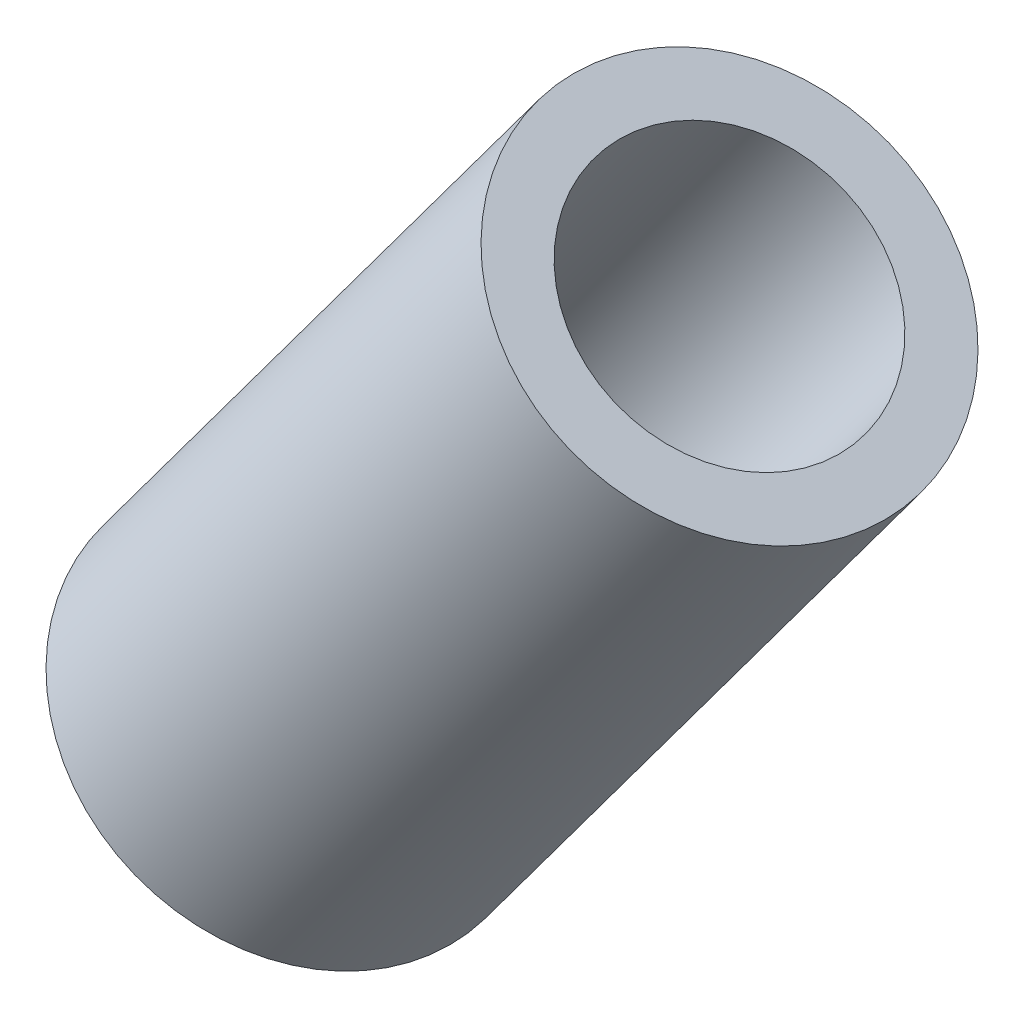
ISO-10303-21;
HEADER;
FILE_DESCRIPTION(('STEP AP214'),'2;1');
FILE_NAME('part.step','',(''),(''),'','','');
FILE_SCHEMA(('AUTOMOTIVE_DESIGN { 1 0 10303 214 1 1 1 1 }'));
ENDSEC;
DATA;
#1=APPLICATION_CONTEXT('core data for automotive mechanical design processes');
#2=APPLICATION_PROTOCOL_DEFINITION('international standard','automotive_design',2000,#1);
#3=PRODUCT_CONTEXT('',#1,'mechanical');
#4=PRODUCT('Part','Part','',(#3));
#5=PRODUCT_RELATED_PRODUCT_CATEGORY('part','',(#4));
#6=PRODUCT_DEFINITION_FORMATION('','',#4);
#7=PRODUCT_DEFINITION_CONTEXT('part definition',#1,'design');
#8=PRODUCT_DEFINITION('design','',#6,#7);
#9=PRODUCT_DEFINITION_SHAPE('','',#8);
#10=(LENGTH_UNIT() NAMED_UNIT(*) SI_UNIT(.MILLI.,.METRE.));
#11=(NAMED_UNIT(*) PLANE_ANGLE_UNIT() SI_UNIT($,.RADIAN.));
#12=(NAMED_UNIT(*) SI_UNIT($,.STERADIAN.) SOLID_ANGLE_UNIT());
#13=UNCERTAINTY_MEASURE_WITH_UNIT(LENGTH_MEASURE(1.E-05),#10,'distance_accuracy_value','');
#14=(GEOMETRIC_REPRESENTATION_CONTEXT(3) GLOBAL_UNCERTAINTY_ASSIGNED_CONTEXT((#13)) GLOBAL_UNIT_ASSIGNED_CONTEXT((#10,
#11,#12)) REPRESENTATION_CONTEXT('',''));
#15=CARTESIAN_POINT('',(0.,0.,0.));
#16=DIRECTION('',(0.,0.,1.));
#17=DIRECTION('',(1.,0.,0.));
#18=AXIS2_PLACEMENT_3D('',#15,#16,#17);
#19=CARTESIAN_POINT('',(0.,0.,0.));
#20=DIRECTION('',(0.596262476018023,0.802789548818902,0.));
#21=DIRECTION('',(-0.802789548818902,0.596262476018023,0.));
#22=AXIS2_PLACEMENT_3D('',#19,#20,#21);
#23=PLANE('',#22);
#24=CARTESIAN_POINT('',(0.,0.,0.));
#25=DIRECTION('',(0.596262476018023,0.802789548818902,0.));
#26=DIRECTION('',(-0.802789548818902,0.596262476018023,0.));
#27=AXIS2_PLACEMENT_3D('',#24,#25,#26);
#28=CIRCLE('',#27,9.525);
#29=CARTESIAN_POINT('',(-7.64657045250004,5.67940008407167,0.));
#30=VERTEX_POINT('',#29);
#31=EDGE_CURVE('E65',#30,#30,#28,.F.);
#32=ORIENTED_EDGE('',*,*,#31,.F.);
#33=EDGE_LOOP('',(#32));
#34=FACE_BOUND('',#33,.T.);
#35=CARTESIAN_POINT('',(0.,0.,0.));
#36=DIRECTION('',(0.596262476018023,0.802789548818902,0.));
#37=DIRECTION('',(-0.802789548818902,0.596262476018023,0.));
#38=AXIS2_PLACEMENT_3D('',#35,#36,#37);
#39=CIRCLE('',#38,13.49375);
#40=CARTESIAN_POINT('',(-10.8326414743751,8.0458167857682,0.));
#41=VERTEX_POINT('',#40);
#42=EDGE_CURVE('E57',#41,#41,#39,.T.);
#43=ORIENTED_EDGE('',*,*,#42,.F.);
#44=EDGE_LOOP('',(#43));
#45=FACE_BOUND('',#44,.T.);
#46=ADVANCED_FACE('F51',(#34,#45),#23,.F.);
#47=CARTESIAN_POINT('',(30.2901337817156,40.7817090800002,0.));
#48=DIRECTION('',(0.596262476018023,0.802789548818902,0.));
#49=DIRECTION('',(-0.802789548818902,0.596262476018023,0.));
#50=AXIS2_PLACEMENT_3D('',#47,#48,#49);
#51=PLANE('',#50);
#52=CARTESIAN_POINT('',(30.2901337817156,40.7817090800002,0.));
#53=DIRECTION('',(0.596262476018023,0.802789548818902,0.));
#54=DIRECTION('',(-0.802789548818902,0.596262476018023,0.));
#55=AXIS2_PLACEMENT_3D('',#52,#53,#54);
#56=CIRCLE('',#55,9.525);
#57=CARTESIAN_POINT('',(22.6435633292155,46.4611091640719,0.));
#58=VERTEX_POINT('',#57);
#59=EDGE_CURVE('E61',#58,#58,#56,.F.);
#60=ORIENTED_EDGE('',*,*,#59,.T.);
#61=EDGE_LOOP('',(#60));
#62=FACE_BOUND('',#61,.T.);
#63=CARTESIAN_POINT('',(30.2901337817156,40.7817090800002,0.));
#64=DIRECTION('',(0.596262476018023,0.802789548818902,0.));
#65=DIRECTION('',(-0.802789548818902,0.596262476018023,0.));
#66=AXIS2_PLACEMENT_3D('',#63,#64,#65);
#67=CIRCLE('',#66,13.49375);
#68=CARTESIAN_POINT('',(19.4574923073405,48.8275258657684,0.));
#69=VERTEX_POINT('',#68);
#70=EDGE_CURVE('E11',#69,#69,#67,.T.);
#71=ORIENTED_EDGE('',*,*,#70,.T.);
#72=EDGE_LOOP('',(#71));
#73=FACE_BOUND('',#72,.T.);
#74=ADVANCED_FACE('F76',(#62,#73),#51,.T.);
#75=CARTESIAN_POINT('',(0.,0.,0.));
#76=DIRECTION('',(0.596262476018023,0.802789548818902,0.));
#77=DIRECTION('',(-0.802789548818902,0.596262476018023,0.));
#78=AXIS2_PLACEMENT_3D('',#75,#76,#77);
#79=CYLINDRICAL_SURFACE('',#78,13.49375);
#80=ORIENTED_EDGE('',*,*,#70,.F.);
#81=EDGE_LOOP('',(#80));
#82=FACE_BOUND('',#81,.T.);
#83=ORIENTED_EDGE('',*,*,#42,.T.);
#84=EDGE_LOOP('',(#83));
#85=FACE_BOUND('',#84,.T.);
#86=ADVANCED_FACE('F81',(#82,#85),#79,.T.);
#87=CARTESIAN_POINT('',(-2.98131238009012,-4.01394774409451,0.));
#88=DIRECTION('',(0.596262476018023,0.802789548818902,0.));
#89=DIRECTION('',(-0.802789548818902,0.596262476018023,0.));
#90=AXIS2_PLACEMENT_3D('',#87,#88,#89);
#91=CYLINDRICAL_SURFACE('',#90,9.525);
#92=ORIENTED_EDGE('',*,*,#31,.T.);
#93=EDGE_LOOP('',(#92));
#94=FACE_BOUND('',#93,.T.);
#95=ORIENTED_EDGE('',*,*,#59,.F.);
#96=EDGE_LOOP('',(#95));
#97=FACE_BOUND('',#96,.T.);
#98=ADVANCED_FACE('F71',(#94,#97),#91,.F.);
#99=CLOSED_SHELL('',(#46,#74,#86,#98));
#100=MANIFOLD_SOLID_BREP('B2',#99);
#101=ADVANCED_BREP_SHAPE_REPRESENTATION('',(#18,#100),#14);
#102=SHAPE_DEFINITION_REPRESENTATION(#9,#101);
ENDSEC;
END-ISO-10303-21;
